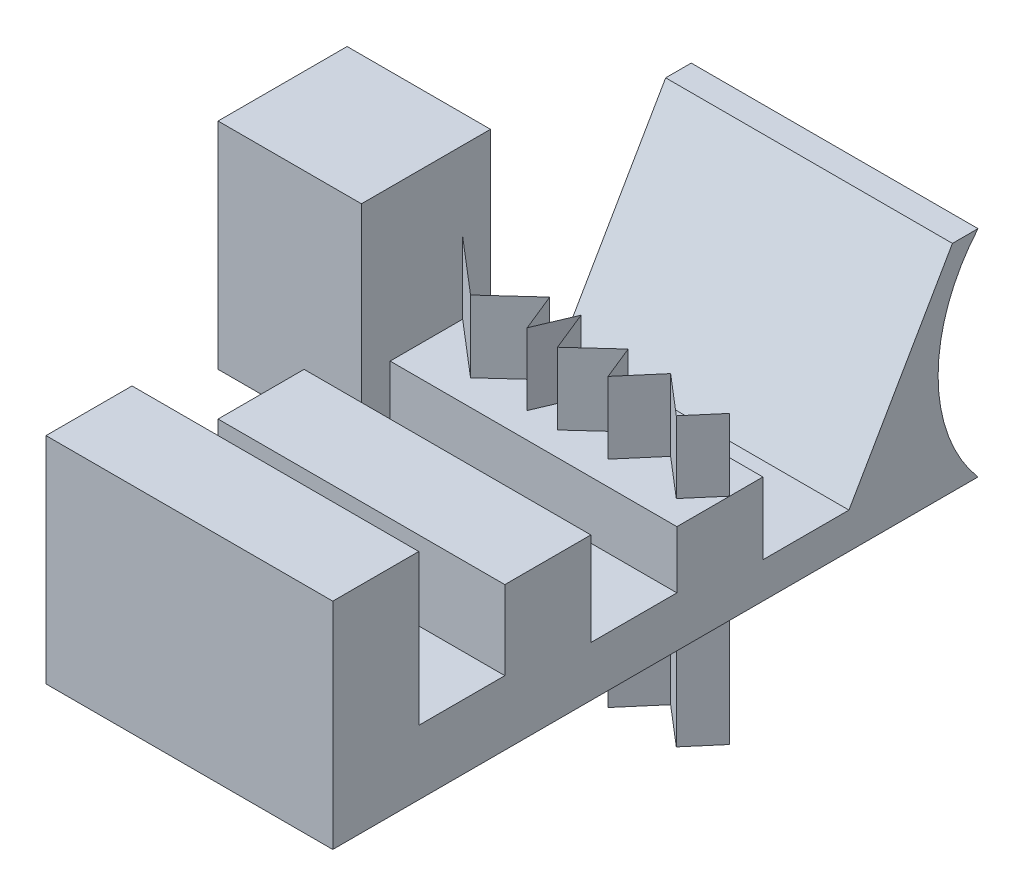
ISO-10303-21;
HEADER;
FILE_DESCRIPTION(('STEP AP214'),'2;1');
FILE_NAME('part.step','',(''),(''),'','','');
FILE_SCHEMA(('AUTOMOTIVE_DESIGN { 1 0 10303 214 1 1 1 1 }'));
ENDSEC;
DATA;
#1=APPLICATION_CONTEXT('core data for automotive mechanical design processes');
#2=APPLICATION_PROTOCOL_DEFINITION('international standard','automotive_design',2000,#1);
#3=PRODUCT_CONTEXT('',#1,'mechanical');
#4=PRODUCT('Part','Part','',(#3));
#5=PRODUCT_RELATED_PRODUCT_CATEGORY('part','',(#4));
#6=PRODUCT_DEFINITION_FORMATION('','',#4);
#7=PRODUCT_DEFINITION_CONTEXT('part definition',#1,'design');
#8=PRODUCT_DEFINITION('design','',#6,#7);
#9=PRODUCT_DEFINITION_SHAPE('','',#8);
#10=(LENGTH_UNIT() NAMED_UNIT(*) SI_UNIT(.MILLI.,.METRE.));
#11=(NAMED_UNIT(*) PLANE_ANGLE_UNIT() SI_UNIT($,.RADIAN.));
#12=(NAMED_UNIT(*) SI_UNIT($,.STERADIAN.) SOLID_ANGLE_UNIT());
#13=UNCERTAINTY_MEASURE_WITH_UNIT(LENGTH_MEASURE(1.E-05),#10,'distance_accuracy_value','');
#14=(GEOMETRIC_REPRESENTATION_CONTEXT(3) GLOBAL_UNCERTAINTY_ASSIGNED_CONTEXT((#13)) GLOBAL_UNIT_ASSIGNED_CONTEXT((#10,
#11,#12)) REPRESENTATION_CONTEXT('',''));
#15=CARTESIAN_POINT('',(0.,0.,0.));
#16=DIRECTION('',(0.,0.,1.));
#17=DIRECTION('',(1.,0.,0.));
#18=AXIS2_PLACEMENT_3D('',#15,#16,#17);
#19=CARTESIAN_POINT('',(-100.,75.,-290.585453274587));
#20=DIRECTION('',(-0.650171661517979,0.,0.759787345616489));
#21=DIRECTION('',(0.759787345616489,0.,0.650171661517979));
#22=AXIS2_PLACEMENT_3D('',#19,#20,#21);
#23=PLANE('',#22);
#24=DIRECTION('',(0.759787345616489,0.,0.650171661517979));
#25=VECTOR('',#24,1.);
#26=CARTESIAN_POINT('',(-100.,125.,-290.585453274587));
#27=LINE('',#26,#25);
#28=CARTESIAN_POINT('',(-100.,125.,-290.585453274587));
#29=VERTEX_POINT('',#28);
#30=CARTESIAN_POINT('',(-61.8619400347087,125.,-257.949629635558));
#31=VERTEX_POINT('',#30);
#32=EDGE_CURVE('E56',#29,#31,#27,.T.);
#33=ORIENTED_EDGE('',*,*,#32,.F.);
#34=DIRECTION('',(0.,1.,0.));
#35=VECTOR('',#34,1.);
#36=CARTESIAN_POINT('',(-100.,75.,-290.585453274587));
#37=LINE('',#36,#35);
#38=CARTESIAN_POINT('',(-100.,-75.,-290.585453274587));
#39=VERTEX_POINT('',#38);
#40=EDGE_CURVE('E12',#39,#29,#37,.T.);
#41=ORIENTED_EDGE('',*,*,#40,.F.);
#42=DIRECTION('',(0.759787345616489,0.,0.650171661517979));
#43=VECTOR('',#42,1.);
#44=CARTESIAN_POINT('',(-100.,-75.,-290.585453274587));
#45=LINE('',#44,#43);
#46=CARTESIAN_POINT('',(-61.8619400347087,-75.,-257.949629635558));
#47=VERTEX_POINT('',#46);
#48=EDGE_CURVE('E131',#39,#47,#45,.T.);
#49=ORIENTED_EDGE('',*,*,#48,.T.);
#50=DIRECTION('',(0.,1.,0.));
#51=VECTOR('',#50,1.);
#52=CARTESIAN_POINT('',(-61.8619400347087,75.,-257.949629635558));
#53=LINE('',#52,#51);
#54=EDGE_CURVE('E171',#47,#31,#53,.T.);
#55=ORIENTED_EDGE('',*,*,#54,.T.);
#56=EDGE_LOOP('',(#33,#41,#49,#55));
#57=FACE_BOUND('',#56,.T.);
#58=ADVANCED_FACE('F50',(#57),#23,.T.);
#59=CARTESIAN_POINT('',(-61.8619400347087,75.,-257.949629635558));
#60=DIRECTION('',(0.674269364021333,0.,0.738485493928126));
#61=DIRECTION('',(0.738485493928126,0.,-0.674269364021333));
#62=AXIS2_PLACEMENT_3D('',#59,#60,#61);
#63=PLANE('',#62);
#64=DIRECTION('',(0.738485493928126,0.,-0.674269364021333));
#65=VECTOR('',#64,1.);
#66=CARTESIAN_POINT('',(-61.8619400347087,125.,-257.949629635558));
#67=LINE('',#66,#65);
#68=CARTESIAN_POINT('',(-32.9917883540292,125.,-284.309333344005));
#69=VERTEX_POINT('',#68);
#70=EDGE_CURVE('E172',#31,#69,#67,.T.);
#71=ORIENTED_EDGE('',*,*,#70,.F.);
#72=ORIENTED_EDGE('',*,*,#54,.F.);
#73=DIRECTION('',(0.738485493928126,0.,-0.674269364021333));
#74=VECTOR('',#73,1.);
#75=CARTESIAN_POINT('',(-61.8619400347087,-75.,-257.949629635558));
#76=LINE('',#75,#74);
#77=CARTESIAN_POINT('',(-32.9917883540292,-75.,-284.309333344005));
#78=VERTEX_POINT('',#77);
#79=EDGE_CURVE('E135',#47,#78,#76,.T.);
#80=ORIENTED_EDGE('',*,*,#79,.T.);
#81=DIRECTION('',(0.,1.,0.));
#82=VECTOR('',#81,1.);
#83=CARTESIAN_POINT('',(-32.9917883540292,75.,-284.309333344005));
#84=LINE('',#83,#82);
#85=EDGE_CURVE('E176',#78,#69,#84,.T.);
#86=ORIENTED_EDGE('',*,*,#85,.T.);
#87=EDGE_LOOP('',(#71,#72,#80,#86));
#88=FACE_BOUND('',#87,.T.);
#89=ADVANCED_FACE('F228',(#88),#63,.T.);
#90=CARTESIAN_POINT('',(-32.9917883540292,75.,-284.309333344005));
#91=DIRECTION('',(-0.926946813223158,0.,0.375192757733185));
#92=DIRECTION('',(0.375192757733185,0.,0.926946813223158));
#93=AXIS2_PLACEMENT_3D('',#90,#91,#92);
#94=PLANE('',#93);
#95=DIRECTION('',(0.375192757733185,0.,0.926946813223158));
#96=VECTOR('',#95,1.);
#97=CARTESIAN_POINT('',(-32.9917883540292,125.,-284.309333344005));
#98=LINE('',#97,#96);
#99=CARTESIAN_POINT('',(-22.3223844720388,125.,-257.949629635558));
#100=VERTEX_POINT('',#99);
#101=EDGE_CURVE('E177',#69,#100,#98,.T.);
#102=ORIENTED_EDGE('',*,*,#101,.F.);
#103=ORIENTED_EDGE('',*,*,#85,.F.);
#104=DIRECTION('',(0.375192757733185,0.,0.926946813223158));
#105=VECTOR('',#104,1.);
#106=CARTESIAN_POINT('',(-32.9917883540292,-75.,-284.309333344005));
#107=LINE('',#106,#105);
#108=CARTESIAN_POINT('',(-22.3223844720388,-75.,-257.949629635558));
#109=VERTEX_POINT('',#108);
#110=EDGE_CURVE('E143',#78,#109,#107,.T.);
#111=ORIENTED_EDGE('',*,*,#110,.T.);
#112=DIRECTION('',(0.,1.,0.));
#113=VECTOR('',#112,1.);
#114=CARTESIAN_POINT('',(-22.3223844720388,75.,-257.949629635558));
#115=LINE('',#114,#113);
#116=EDGE_CURVE('E181',#109,#100,#115,.T.);
#117=ORIENTED_EDGE('',*,*,#116,.T.);
#118=EDGE_LOOP('',(#102,#103,#111,#117));
#119=FACE_BOUND('',#118,.T.);
#120=ADVANCED_FACE('F232',(#119),#94,.T.);
#121=CARTESIAN_POINT('',(-22.3223844720388,75.,-257.949629635558));
#122=DIRECTION('',(0.920751720674579,0.,0.39014903418412));
#123=DIRECTION('',(0.39014903418412,0.,-0.920751720674579));
#124=AXIS2_PLACEMENT_3D('',#121,#122,#123);
#125=PLANE('',#124);
#126=DIRECTION('',(0.39014903418412,0.,-0.920751720674579));
#127=VECTOR('',#126,1.);
#128=CARTESIAN_POINT('',(-22.3223844720388,125.,-257.949629635558));
#129=LINE('',#128,#127);
#130=CARTESIAN_POINT('',(-11.1530184938842,125.,-284.309333344005));
#131=VERTEX_POINT('',#130);
#132=EDGE_CURVE('E182',#100,#131,#129,.T.);
#133=ORIENTED_EDGE('',*,*,#132,.F.);
#134=ORIENTED_EDGE('',*,*,#116,.F.);
#135=DIRECTION('',(0.39014903418412,0.,-0.920751720674579));
#136=VECTOR('',#135,1.);
#137=CARTESIAN_POINT('',(-22.3223844720388,-75.,-257.949629635558));
#138=LINE('',#137,#136);
#139=CARTESIAN_POINT('',(-11.1530184938842,-75.,-284.309333344005));
#140=VERTEX_POINT('',#139);
#141=EDGE_CURVE('E148',#109,#140,#138,.T.);
#142=ORIENTED_EDGE('',*,*,#141,.T.);
#143=DIRECTION('',(0.,1.,0.));
#144=VECTOR('',#143,1.);
#145=CARTESIAN_POINT('',(-11.1530184938842,75.,-284.309333344005));
#146=LINE('',#145,#144);
#147=EDGE_CURVE('E186',#140,#131,#146,.T.);
#148=ORIENTED_EDGE('',*,*,#147,.T.);
#149=EDGE_LOOP('',(#133,#134,#142,#148));
#150=FACE_BOUND('',#149,.T.);
#151=ADVANCED_FACE('F236',(#150),#125,.T.);
#152=CARTESIAN_POINT('',(-11.1530184938842,75.,-284.309333344005));
#153=DIRECTION('',(-0.926946813223157,0.,0.375192757733186));
#154=DIRECTION('',(0.375192757733186,0.,0.926946813223157));
#155=AXIS2_PLACEMENT_3D('',#152,#153,#154);
#156=PLANE('',#155);
#157=DIRECTION('',(0.375192757733186,0.,0.926946813223157));
#158=VECTOR('',#157,1.);
#159=CARTESIAN_POINT('',(-11.1530184938842,125.,-284.309333344005));
#160=LINE('',#159,#158);
#161=CARTESIAN_POINT('',(0.,125.,-256.754817064997));
#162=VERTEX_POINT('',#161);
#163=EDGE_CURVE('E187',#131,#162,#160,.T.);
#164=ORIENTED_EDGE('',*,*,#163,.F.);
#165=ORIENTED_EDGE('',*,*,#147,.F.);
#166=DIRECTION('',(0.375192757733186,0.,0.926946813223157));
#167=VECTOR('',#166,1.);
#168=CARTESIAN_POINT('',(-11.1530184938842,-75.,-284.309333344005));
#169=LINE('',#168,#167);
#170=CARTESIAN_POINT('',(0.,-75.,-256.754817064997));
#171=VERTEX_POINT('',#170);
#172=EDGE_CURVE('E151',#140,#171,#169,.T.);
#173=ORIENTED_EDGE('',*,*,#172,.T.);
#174=DIRECTION('',(0.,1.,0.));
#175=VECTOR('',#174,1.);
#176=CARTESIAN_POINT('',(0.,75.,-256.754817064997));
#177=LINE('',#176,#175);
#178=EDGE_CURVE('E191',#171,#162,#177,.T.);
#179=ORIENTED_EDGE('',*,*,#178,.T.);
#180=EDGE_LOOP('',(#164,#165,#173,#179));
#181=FACE_BOUND('',#180,.T.);
#182=ADVANCED_FACE('F240',(#181),#156,.T.);
#183=CARTESIAN_POINT('',(0.,75.,-256.754817064997));
#184=DIRECTION('',(0.674269364021333,0.,0.738485493928126));
#185=DIRECTION('',(0.738485493928126,0.,-0.674269364021333));
#186=AXIS2_PLACEMENT_3D('',#183,#184,#185);
#187=PLANE('',#186);
#188=DIRECTION('',(0.738485493928126,0.,-0.674269364021333));
#189=VECTOR('',#188,1.);
#190=CARTESIAN_POINT('',(0.,125.,-256.754817064997));
#191=LINE('',#190,#189);
#192=CARTESIAN_POINT('',(25.7440446324172,125.,-280.260249120682));
#193=VERTEX_POINT('',#192);
#194=EDGE_CURVE('E192',#162,#193,#191,.T.);
#195=ORIENTED_EDGE('',*,*,#194,.F.);
#196=ORIENTED_EDGE('',*,*,#178,.F.);
#197=DIRECTION('',(0.738485493928126,0.,-0.674269364021333));
#198=VECTOR('',#197,1.);
#199=CARTESIAN_POINT('',(0.,-75.,-256.754817064997));
#200=LINE('',#199,#198);
#201=CARTESIAN_POINT('',(25.7440446324172,-75.,-280.260249120682));
#202=VERTEX_POINT('',#201);
#203=EDGE_CURVE('E154',#171,#202,#200,.T.);
#204=ORIENTED_EDGE('',*,*,#203,.T.);
#205=DIRECTION('',(0.,1.,0.));
#206=VECTOR('',#205,1.);
#207=CARTESIAN_POINT('',(25.7440446324172,75.,-280.260249120682));
#208=LINE('',#207,#206);
#209=EDGE_CURVE('E196',#202,#193,#208,.T.);
#210=ORIENTED_EDGE('',*,*,#209,.T.);
#211=EDGE_LOOP('',(#195,#196,#204,#210));
#212=FACE_BOUND('',#211,.T.);
#213=ADVANCED_FACE('F244',(#212),#187,.T.);
#214=CARTESIAN_POINT('',(25.7440446324172,75.,-280.260249120682));
#215=DIRECTION('',(-0.926946813223158,0.,0.375192757733185));
#216=DIRECTION('',(0.375192757733185,0.,0.926946813223158));
#217=AXIS2_PLACEMENT_3D('',#214,#215,#216);
#218=PLANE('',#217);
#219=DIRECTION('',(0.375192757733185,0.,0.926946813223158));
#220=VECTOR('',#219,1.);
#221=CARTESIAN_POINT('',(25.7440446324172,125.,-280.260249120682));
#222=LINE('',#221,#220);
#223=CARTESIAN_POINT('',(35.258148083528,125.,-256.754817064997));
#224=VERTEX_POINT('',#223);
#225=EDGE_CURVE('E197',#193,#224,#222,.T.);
#226=ORIENTED_EDGE('',*,*,#225,.F.);
#227=ORIENTED_EDGE('',*,*,#209,.F.);
#228=DIRECTION('',(0.375192757733185,0.,0.926946813223158));
#229=VECTOR('',#228,1.);
#230=CARTESIAN_POINT('',(25.7440446324172,-75.,-280.260249120682));
#231=LINE('',#230,#229);
#232=CARTESIAN_POINT('',(35.258148083528,-75.,-256.754817064997));
#233=VERTEX_POINT('',#232);
#234=EDGE_CURVE('E157',#202,#233,#231,.T.);
#235=ORIENTED_EDGE('',*,*,#234,.T.);
#236=DIRECTION('',(0.,1.,0.));
#237=VECTOR('',#236,1.);
#238=CARTESIAN_POINT('',(35.258148083528,75.,-256.754817064997));
#239=LINE('',#238,#237);
#240=EDGE_CURVE('E201',#233,#224,#239,.T.);
#241=ORIENTED_EDGE('',*,*,#240,.T.);
#242=EDGE_LOOP('',(#226,#227,#235,#241));
#243=FACE_BOUND('',#242,.T.);
#244=ADVANCED_FACE('F248',(#243),#218,.T.);
#245=CARTESIAN_POINT('',(35.258148083528,75.,-256.754817064997));
#246=DIRECTION('',(0.75978734561649,0.,0.650171661517979));
#247=DIRECTION('',(0.650171661517979,0.,-0.75978734561649));
#248=AXIS2_PLACEMENT_3D('',#245,#246,#247);
#249=PLANE('',#248);
#250=DIRECTION('',(0.650171661517978,0.,-0.75978734561649));
#251=VECTOR('',#250,1.);
#252=CARTESIAN_POINT('',(35.258148083528,125.,-256.754817064997));
#253=LINE('',#252,#251);
#254=CARTESIAN_POINT('',(55.3724154538836,125.,-280.260249120682));
#255=VERTEX_POINT('',#254);
#256=EDGE_CURVE('E202',#224,#255,#253,.T.);
#257=ORIENTED_EDGE('',*,*,#256,.F.);
#258=ORIENTED_EDGE('',*,*,#240,.F.);
#259=DIRECTION('',(0.650171661517978,0.,-0.75978734561649));
#260=VECTOR('',#259,1.);
#261=CARTESIAN_POINT('',(35.258148083528,-75.,-256.754817064997));
#262=LINE('',#261,#260);
#263=CARTESIAN_POINT('',(55.3724154538836,-75.,-280.260249120682));
#264=VERTEX_POINT('',#263);
#265=EDGE_CURVE('E160',#233,#264,#262,.T.);
#266=ORIENTED_EDGE('',*,*,#265,.T.);
#267=DIRECTION('',(0.,1.,0.));
#268=VECTOR('',#267,1.);
#269=CARTESIAN_POINT('',(55.3724154538836,75.,-280.260249120682));
#270=LINE('',#269,#268);
#271=EDGE_CURVE('E206',#264,#255,#270,.T.);
#272=ORIENTED_EDGE('',*,*,#271,.T.);
#273=EDGE_LOOP('',(#257,#258,#266,#272));
#274=FACE_BOUND('',#273,.T.);
#275=ADVANCED_FACE('F252',(#274),#249,.T.);
#276=CARTESIAN_POINT('',(55.3724154538836,75.,-280.260249120682));
#277=DIRECTION('',(-0.650171661517979,0.,0.75978734561649));
#278=DIRECTION('',(0.75978734561649,0.,0.650171661517979));
#279=AXIS2_PLACEMENT_3D('',#276,#277,#278);
#280=PLANE('',#279);
#281=DIRECTION('',(0.75978734561649,0.,0.650171661517979));
#282=VECTOR('',#281,1.);
#283=CARTESIAN_POINT('',(55.3724154538836,125.,-280.260249120682));
#284=LINE('',#283,#282);
#285=CARTESIAN_POINT('',(82.8407455675977,125.,-256.754817064997));
#286=VERTEX_POINT('',#285);
#287=EDGE_CURVE('E207',#255,#286,#284,.T.);
#288=ORIENTED_EDGE('',*,*,#287,.F.);
#289=ORIENTED_EDGE('',*,*,#271,.F.);
#290=DIRECTION('',(0.75978734561649,0.,0.650171661517979));
#291=VECTOR('',#290,1.);
#292=CARTESIAN_POINT('',(55.3724154538836,-75.,-280.260249120682));
#293=LINE('',#292,#291);
#294=CARTESIAN_POINT('',(82.8407455675977,-75.,-256.754817064997));
#295=VERTEX_POINT('',#294);
#296=EDGE_CURVE('E163',#264,#295,#293,.T.);
#297=ORIENTED_EDGE('',*,*,#296,.T.);
#298=DIRECTION('',(0.,1.,0.));
#299=VECTOR('',#298,1.);
#300=CARTESIAN_POINT('',(82.8407455675977,75.,-256.754817064997));
#301=LINE('',#300,#299);
#302=EDGE_CURVE('E141',#295,#286,#301,.T.);
#303=ORIENTED_EDGE('',*,*,#302,.T.);
#304=EDGE_LOOP('',(#288,#289,#297,#303));
#305=FACE_BOUND('',#304,.T.);
#306=ADVANCED_FACE('F256',(#305),#280,.T.);
#307=CARTESIAN_POINT('',(82.8407455675977,75.,-256.754817064997));
#308=DIRECTION('',(0.75978734561649,0.,0.650171661517978));
#309=DIRECTION('',(0.650171661517978,0.,-0.75978734561649));
#310=AXIS2_PLACEMENT_3D('',#307,#308,#309);
#311=PLANE('',#310);
#312=DIRECTION('',(0.650171661517978,0.,-0.75978734561649));
#313=VECTOR('',#312,1.);
#314=CARTESIAN_POINT('',(82.8407455675977,125.,-256.754817064997));
#315=LINE('',#314,#313);
#316=CARTESIAN_POINT('',(100.,125.,-276.807035809065));
#317=VERTEX_POINT('',#316);
#318=EDGE_CURVE('E67',#286,#317,#315,.T.);
#319=ORIENTED_EDGE('',*,*,#318,.F.);
#320=ORIENTED_EDGE('',*,*,#302,.F.);
#321=DIRECTION('',(0.650171661517978,0.,-0.75978734561649));
#322=VECTOR('',#321,1.);
#323=CARTESIAN_POINT('',(82.8407455675977,-75.,-256.754817064997));
#324=LINE('',#323,#322);
#325=CARTESIAN_POINT('',(100.,-75.,-276.807035809065));
#326=VERTEX_POINT('',#325);
#327=EDGE_CURVE('E166',#295,#326,#324,.T.);
#328=ORIENTED_EDGE('',*,*,#327,.T.);
#329=DIRECTION('',(0.,1.,0.));
#330=VECTOR('',#329,1.);
#331=CARTESIAN_POINT('',(100.,75.,-276.807035809065));
#332=LINE('',#331,#330);
#333=EDGE_CURVE('E63',#326,#317,#332,.T.);
#334=ORIENTED_EDGE('',*,*,#333,.T.);
#335=EDGE_LOOP('',(#319,#320,#328,#334));
#336=FACE_BOUND('',#335,.T.);
#337=ADVANCED_FACE('F258',(#336),#311,.T.);
#338=OPEN_SHELL('',(#58,#89,#120,#151,#182,#213,#244,#275,#306,#337));
#339=SHELL_BASED_SURFACE_MODEL('B2',(#338));
#340=CARTESIAN_POINT('',(-230.,150.,-250.));
#341=DIRECTION('',(-1.,0.,0.));
#342=DIRECTION('',(0.,0.,1.));
#343=AXIS2_PLACEMENT_3D('',#340,#341,#342);
#344=PLANE('',#343);
#345=DIRECTION('',(0.,0.,-1.));
#346=VECTOR('',#345,1.);
#347=CARTESIAN_POINT('',(-230.,0.,-250.));
#348=LINE('',#347,#346);
#349=CARTESIAN_POINT('',(-230.,0.,-250.));
#350=VERTEX_POINT('',#349);
#351=CARTESIAN_POINT('',(-230.,0.,-340.));
#352=VERTEX_POINT('',#351);
#353=EDGE_CURVE('E455',#350,#352,#348,.T.);
#354=ORIENTED_EDGE('',*,*,#353,.F.);
#355=DIRECTION('',(0.,-1.,0.));
#356=VECTOR('',#355,1.);
#357=CARTESIAN_POINT('',(-230.,150.,-250.));
#358=LINE('',#357,#356);
#359=CARTESIAN_POINT('',(-230.,150.,-250.));
#360=VERTEX_POINT('',#359);
#361=EDGE_CURVE('E48',#360,#350,#358,.T.);
#362=ORIENTED_EDGE('',*,*,#361,.F.);
#363=DIRECTION('',(0.,0.,-1.));
#364=VECTOR('',#363,1.);
#365=CARTESIAN_POINT('',(-230.,150.,-250.));
#366=LINE('',#365,#364);
#367=CARTESIAN_POINT('',(-230.,150.,-340.));
#368=VERTEX_POINT('',#367);
#369=EDGE_CURVE('E449',#360,#368,#366,.T.);
#370=ORIENTED_EDGE('',*,*,#369,.T.);
#371=DIRECTION('',(0.,-1.,0.));
#372=VECTOR('',#371,1.);
#373=CARTESIAN_POINT('',(-230.,150.,-340.));
#374=LINE('',#373,#372);
#375=EDGE_CURVE('E394',#368,#352,#374,.T.);
#376=ORIENTED_EDGE('',*,*,#375,.T.);
#377=EDGE_LOOP('',(#354,#362,#370,#376));
#378=FACE_BOUND('',#377,.T.);
#379=ADVANCED_FACE('F391',(#378),#344,.T.);
#380=CARTESIAN_POINT('',(-230.,150.,-250.));
#381=DIRECTION('',(0.,0.,1.));
#382=DIRECTION('',(0.,-1.,0.));
#383=AXIS2_PLACEMENT_3D('',#380,#381,#382);
#384=PLANE('',#383);
#385=DIRECTION('',(-1.,0.,0.));
#386=VECTOR('',#385,1.);
#387=CARTESIAN_POINT('',(-230.,0.,-250.));
#388=LINE('',#387,#386);
#389=CARTESIAN_POINT('',(-130.,0.,-250.));
#390=VERTEX_POINT('',#389);
#391=EDGE_CURVE('E451',#390,#350,#388,.T.);
#392=ORIENTED_EDGE('',*,*,#391,.F.);
#393=DIRECTION('',(0.,-1.,0.));
#394=VECTOR('',#393,1.);
#395=CARTESIAN_POINT('',(-130.,150.,-250.));
#396=LINE('',#395,#394);
#397=CARTESIAN_POINT('',(-130.,150.,-250.));
#398=VERTEX_POINT('',#397);
#399=EDGE_CURVE('E400',#398,#390,#396,.T.);
#400=ORIENTED_EDGE('',*,*,#399,.F.);
#401=DIRECTION('',(-1.,0.,0.));
#402=VECTOR('',#401,1.);
#403=CARTESIAN_POINT('',(-230.,150.,-250.));
#404=LINE('',#403,#402);
#405=EDGE_CURVE('E446',#398,#360,#404,.T.);
#406=ORIENTED_EDGE('',*,*,#405,.T.);
#407=ORIENTED_EDGE('',*,*,#361,.T.);
#408=EDGE_LOOP('',(#392,#400,#406,#407));
#409=FACE_BOUND('',#408,.T.);
#410=ADVANCED_FACE('F465',(#409),#384,.T.);
#411=CARTESIAN_POINT('',(-130.,150.,-250.));
#412=DIRECTION('',(1.,0.,0.));
#413=DIRECTION('',(0.,0.,-1.));
#414=AXIS2_PLACEMENT_3D('',#411,#412,#413);
#415=PLANE('',#414);
#416=DIRECTION('',(0.,0.,1.));
#417=VECTOR('',#416,1.);
#418=CARTESIAN_POINT('',(-130.,0.,-250.));
#419=LINE('',#418,#417);
#420=CARTESIAN_POINT('',(-130.,0.,-340.));
#421=VERTEX_POINT('',#420);
#422=EDGE_CURVE('E441',#421,#390,#419,.T.);
#423=ORIENTED_EDGE('',*,*,#422,.F.);
#424=DIRECTION('',(0.,-1.,0.));
#425=VECTOR('',#424,1.);
#426=CARTESIAN_POINT('',(-130.,150.,-340.));
#427=LINE('',#426,#425);
#428=CARTESIAN_POINT('',(-130.,150.,-340.));
#429=VERTEX_POINT('',#428);
#430=EDGE_CURVE('E436',#429,#421,#427,.T.);
#431=ORIENTED_EDGE('',*,*,#430,.F.);
#432=DIRECTION('',(0.,0.,1.));
#433=VECTOR('',#432,1.);
#434=CARTESIAN_POINT('',(-130.,150.,-250.));
#435=LINE('',#434,#433);
#436=EDGE_CURVE('E439',#429,#398,#435,.T.);
#437=ORIENTED_EDGE('',*,*,#436,.T.);
#438=ORIENTED_EDGE('',*,*,#399,.T.);
#439=EDGE_LOOP('',(#423,#431,#437,#438));
#440=FACE_BOUND('',#439,.T.);
#441=ADVANCED_FACE('F438',(#440),#415,.T.);
#442=CARTESIAN_POINT('',(-230.,150.,-340.));
#443=DIRECTION('',(0.,0.,-1.));
#444=DIRECTION('',(0.,1.,0.));
#445=AXIS2_PLACEMENT_3D('',#442,#443,#444);
#446=PLANE('',#445);
#447=DIRECTION('',(1.,0.,0.));
#448=VECTOR('',#447,1.);
#449=CARTESIAN_POINT('',(-230.,0.,-340.));
#450=LINE('',#449,#448);
#451=EDGE_CURVE('E458',#352,#421,#450,.T.);
#452=ORIENTED_EDGE('',*,*,#451,.F.);
#453=ORIENTED_EDGE('',*,*,#375,.F.);
#454=DIRECTION('',(1.,0.,0.));
#455=VECTOR('',#454,1.);
#456=CARTESIAN_POINT('',(-230.,150.,-340.));
#457=LINE('',#456,#455);
#458=EDGE_CURVE('E445',#368,#429,#457,.T.);
#459=ORIENTED_EDGE('',*,*,#458,.T.);
#460=ORIENTED_EDGE('',*,*,#430,.T.);
#461=EDGE_LOOP('',(#452,#453,#459,#460));
#462=FACE_BOUND('',#461,.T.);
#463=ADVANCED_FACE('F448',(#462),#446,.T.);
#464=CARTESIAN_POINT('',(0.,150.,0.));
#465=DIRECTION('',(0.,-1.,0.));
#466=DIRECTION('',(0.,0.,-1.));
#467=AXIS2_PLACEMENT_3D('',#464,#465,#466);
#468=PLANE('',#467);
#469=ORIENTED_EDGE('',*,*,#369,.F.);
#470=ORIENTED_EDGE('',*,*,#405,.F.);
#471=ORIENTED_EDGE('',*,*,#436,.F.);
#472=ORIENTED_EDGE('',*,*,#458,.F.);
#473=EDGE_LOOP('',(#469,#470,#471,#472));
#474=FACE_BOUND('',#473,.T.);
#475=ADVANCED_FACE('F444',(#474),#468,.F.);
#476=CARTESIAN_POINT('',(0.,0.,0.));
#477=DIRECTION('',(0.,-1.,0.));
#478=DIRECTION('',(0.,0.,-1.));
#479=AXIS2_PLACEMENT_3D('',#476,#477,#478);
#480=PLANE('',#479);
#481=ORIENTED_EDGE('',*,*,#353,.T.);
#482=ORIENTED_EDGE('',*,*,#451,.T.);
#483=ORIENTED_EDGE('',*,*,#422,.T.);
#484=ORIENTED_EDGE('',*,*,#391,.T.);
#485=EDGE_LOOP('',(#481,#482,#483,#484));
#486=FACE_BOUND('',#485,.T.);
#487=ADVANCED_FACE('F464',(#486),#480,.T.);
#488=CLOSED_SHELL('',(#379,#410,#441,#463,#475,#487));
#489=MANIFOLD_SOLID_BREP('B6',#488);
#490=CARTESIAN_POINT('',(100.,0.,-450.));
#491=DIRECTION('',(0.,1.,0.));
#492=DIRECTION('',(0.,0.,1.));
#493=AXIS2_PLACEMENT_3D('',#490,#491,#492);
#494=PLANE('',#493);
#495=DIRECTION('',(0.,0.,-1.));
#496=VECTOR('',#495,1.);
#497=CARTESIAN_POINT('',(-100.,0.,-450.));
#498=LINE('',#497,#496);
#499=CARTESIAN_POINT('',(-100.,0.,0.));
#500=VERTEX_POINT('',#499);
#501=CARTESIAN_POINT('',(-100.,0.,-450.));
#502=VERTEX_POINT('',#501);
#503=EDGE_CURVE('E658',#500,#502,#498,.T.);
#504=ORIENTED_EDGE('',*,*,#503,.T.);
#505=DIRECTION('',(-1.,0.,0.));
#506=VECTOR('',#505,1.);
#507=CARTESIAN_POINT('',(100.,0.,-450.));
#508=LINE('',#507,#506);
#509=CARTESIAN_POINT('',(100.,0.,-450.));
#510=VERTEX_POINT('',#509);
#511=EDGE_CURVE('E389',#510,#502,#508,.T.);
#512=ORIENTED_EDGE('',*,*,#511,.F.);
#513=DIRECTION('',(0.,0.,-1.));
#514=VECTOR('',#513,1.);
#515=CARTESIAN_POINT('',(100.,0.,-450.));
#516=LINE('',#515,#514);
#517=CARTESIAN_POINT('',(100.,0.,0.));
#518=VERTEX_POINT('',#517);
#519=EDGE_CURVE('E688',#518,#510,#516,.T.);
#520=ORIENTED_EDGE('',*,*,#519,.F.);
#521=DIRECTION('',(-1.,0.,0.));
#522=VECTOR('',#521,1.);
#523=CARTESIAN_POINT('',(100.,0.,0.));
#524=LINE('',#523,#522);
#525=EDGE_CURVE('E654',#518,#500,#524,.T.);
#526=ORIENTED_EDGE('',*,*,#525,.T.);
#527=EDGE_LOOP('',(#504,#512,#520,#526));
#528=FACE_BOUND('',#527,.T.);
#529=ADVANCED_FACE('F514',(#528),#494,.F.);
#530=CARTESIAN_POINT('',(100.,75.,-537.177978870813));
#531=DIRECTION('',(-1.,0.,0.));
#532=DIRECTION('',(0.,0.,1.));
#533=AXIS2_PLACEMENT_3D('',#530,#531,#532);
#534=CYLINDRICAL_SURFACE('',#533,115.);
#535=CARTESIAN_POINT('',(-100.,75.,-537.177978870813));
#536=DIRECTION('',(-1.,0.,0.));
#537=DIRECTION('',(0.,0.,-1.));
#538=AXIS2_PLACEMENT_3D('',#535,#536,#537);
#539=CIRCLE('',#538,115.);
#540=CARTESIAN_POINT('',(-100.,150.,-450.));
#541=VERTEX_POINT('',#540);
#542=EDGE_CURVE('E661',#502,#541,#539,.T.);
#543=ORIENTED_EDGE('',*,*,#542,.T.);
#544=DIRECTION('',(-1.,0.,0.));
#545=VECTOR('',#544,1.);
#546=CARTESIAN_POINT('',(100.,150.,-450.));
#547=LINE('',#546,#545);
#548=CARTESIAN_POINT('',(100.,150.,-450.));
#549=VERTEX_POINT('',#548);
#550=EDGE_CURVE('E522',#549,#541,#547,.T.);
#551=ORIENTED_EDGE('',*,*,#550,.F.);
#552=CARTESIAN_POINT('',(100.,75.,-537.177978870813));
#553=DIRECTION('',(-1.,0.,0.));
#554=DIRECTION('',(0.,0.,-1.));
#555=AXIS2_PLACEMENT_3D('',#552,#553,#554);
#556=CIRCLE('',#555,115.);
#557=EDGE_CURVE('E597',#510,#549,#556,.T.);
#558=ORIENTED_EDGE('',*,*,#557,.F.);
#559=ORIENTED_EDGE('',*,*,#511,.T.);
#560=EDGE_LOOP('',(#543,#551,#558,#559));
#561=FACE_BOUND('',#560,.T.);
#562=ADVANCED_FACE('F786',(#561),#534,.F.);
#563=CARTESIAN_POINT('',(100.,150.,-432.168783648703));
#564=DIRECTION('',(0.,-1.,0.));
#565=DIRECTION('',(0.,0.,-1.));
#566=AXIS2_PLACEMENT_3D('',#563,#564,#565);
#567=PLANE('',#566);
#568=DIRECTION('',(0.,0.,1.));
#569=VECTOR('',#568,1.);
#570=CARTESIAN_POINT('',(-100.,150.,-432.168783648703));
#571=LINE('',#570,#569);
#572=CARTESIAN_POINT('',(-100.,150.,-432.168783648703));
#573=VERTEX_POINT('',#572);
#574=EDGE_CURVE('E663',#541,#573,#571,.T.);
#575=ORIENTED_EDGE('',*,*,#574,.T.);
#576=DIRECTION('',(-1.,0.,0.));
#577=VECTOR('',#576,1.);
#578=CARTESIAN_POINT('',(100.,150.,-432.168783648703));
#579=LINE('',#578,#577);
#580=CARTESIAN_POINT('',(100.,150.,-432.168783648703));
#581=VERTEX_POINT('',#580);
#582=EDGE_CURVE('E719',#581,#573,#579,.T.);
#583=ORIENTED_EDGE('',*,*,#582,.F.);
#584=DIRECTION('',(0.,0.,1.));
#585=VECTOR('',#584,1.);
#586=CARTESIAN_POINT('',(100.,150.,-432.168783648703));
#587=LINE('',#586,#585);
#588=EDGE_CURVE('E727',#549,#581,#587,.T.);
#589=ORIENTED_EDGE('',*,*,#588,.F.);
#590=ORIENTED_EDGE('',*,*,#550,.T.);
#591=EDGE_LOOP('',(#575,#583,#589,#590));
#592=FACE_BOUND('',#591,.T.);
#593=ADVANCED_FACE('F725',(#592),#567,.F.);
#594=CARTESIAN_POINT('',(100.,25.,-360.));
#595=DIRECTION('',(0.,-0.499999999999997,-0.86602540378444));
#596=DIRECTION('',(0.,0.86602540378444,-0.499999999999997));
#597=AXIS2_PLACEMENT_3D('',#594,#595,#596);
#598=PLANE('',#597);
#599=DIRECTION('',(0.,-0.86602540378444,0.499999999999997));
#600=VECTOR('',#599,1.);
#601=CARTESIAN_POINT('',(-100.,25.,-360.));
#602=LINE('',#601,#600);
#603=CARTESIAN_POINT('',(-100.,25.,-360.));
#604=VERTEX_POINT('',#603);
#605=EDGE_CURVE('E665',#573,#604,#602,.T.);
#606=ORIENTED_EDGE('',*,*,#605,.T.);
#607=DIRECTION('',(-1.,0.,0.));
#608=VECTOR('',#607,1.);
#609=CARTESIAN_POINT('',(100.,25.,-360.));
#610=LINE('',#609,#608);
#611=CARTESIAN_POINT('',(100.,25.,-360.));
#612=VERTEX_POINT('',#611);
#613=EDGE_CURVE('E716',#612,#604,#610,.T.);
#614=ORIENTED_EDGE('',*,*,#613,.F.);
#615=DIRECTION('',(0.,-0.86602540378444,0.499999999999997));
#616=VECTOR('',#615,1.);
#617=CARTESIAN_POINT('',(100.,25.,-360.));
#618=LINE('',#617,#616);
#619=EDGE_CURVE('E745',#581,#612,#618,.T.);
#620=ORIENTED_EDGE('',*,*,#619,.F.);
#621=ORIENTED_EDGE('',*,*,#582,.T.);
#622=EDGE_LOOP('',(#606,#614,#620,#621));
#623=FACE_BOUND('',#622,.T.);
#624=ADVANCED_FACE('F736',(#623),#598,.F.);
#625=CARTESIAN_POINT('',(100.,25.,-300.));
#626=DIRECTION('',(0.,-1.,0.));
#627=DIRECTION('',(0.,0.,-1.));
#628=AXIS2_PLACEMENT_3D('',#625,#626,#627);
#629=PLANE('',#628);
#630=DIRECTION('',(0.,0.,1.));
#631=VECTOR('',#630,1.);
#632=CARTESIAN_POINT('',(-100.,25.,-300.));
#633=LINE('',#632,#631);
#634=CARTESIAN_POINT('',(-100.,25.,-300.));
#635=VERTEX_POINT('',#634);
#636=EDGE_CURVE('E667',#604,#635,#633,.T.);
#637=ORIENTED_EDGE('',*,*,#636,.T.);
#638=DIRECTION('',(-1.,0.,0.));
#639=VECTOR('',#638,1.);
#640=CARTESIAN_POINT('',(100.,25.,-300.));
#641=LINE('',#640,#639);
#642=CARTESIAN_POINT('',(100.,25.,-300.));
#643=VERTEX_POINT('',#642);
#644=EDGE_CURVE('E713',#643,#635,#641,.T.);
#645=ORIENTED_EDGE('',*,*,#644,.F.);
#646=DIRECTION('',(0.,0.,1.));
#647=VECTOR('',#646,1.);
#648=CARTESIAN_POINT('',(100.,25.,-300.));
#649=LINE('',#648,#647);
#650=EDGE_CURVE('E742',#612,#643,#649,.T.);
#651=ORIENTED_EDGE('',*,*,#650,.F.);
#652=ORIENTED_EDGE('',*,*,#613,.T.);
#653=EDGE_LOOP('',(#637,#645,#651,#652));
#654=FACE_BOUND('',#653,.T.);
#655=ADVANCED_FACE('F740',(#654),#629,.F.);
#656=CARTESIAN_POINT('',(100.,75.,-300.));
#657=DIRECTION('',(0.,0.,1.));
#658=DIRECTION('',(0.,-1.,0.));
#659=AXIS2_PLACEMENT_3D('',#656,#657,#658);
#660=PLANE('',#659);
#661=DIRECTION('',(0.,1.,0.));
#662=VECTOR('',#661,1.);
#663=CARTESIAN_POINT('',(-100.,75.,-300.));
#664=LINE('',#663,#662);
#665=CARTESIAN_POINT('',(-100.,75.,-300.));
#666=VERTEX_POINT('',#665);
#667=EDGE_CURVE('E669',#635,#666,#664,.T.);
#668=ORIENTED_EDGE('',*,*,#667,.T.);
#669=DIRECTION('',(-1.,0.,0.));
#670=VECTOR('',#669,1.);
#671=CARTESIAN_POINT('',(100.,75.,-300.));
#672=LINE('',#671,#670);
#673=CARTESIAN_POINT('',(100.,75.,-300.));
#674=VERTEX_POINT('',#673);
#675=EDGE_CURVE('E710',#674,#666,#672,.T.);
#676=ORIENTED_EDGE('',*,*,#675,.F.);
#677=DIRECTION('',(0.,1.,0.));
#678=VECTOR('',#677,1.);
#679=CARTESIAN_POINT('',(100.,75.,-300.));
#680=LINE('',#679,#678);
#681=EDGE_CURVE('E744',#643,#674,#680,.T.);
#682=ORIENTED_EDGE('',*,*,#681,.F.);
#683=ORIENTED_EDGE('',*,*,#644,.T.);
#684=EDGE_LOOP('',(#668,#676,#682,#683));
#685=FACE_BOUND('',#684,.T.);
#686=ADVANCED_FACE('F799',(#685),#660,.F.);
#687=CARTESIAN_POINT('',(100.,75.,-240.));
#688=DIRECTION('',(0.,-1.,0.));
#689=DIRECTION('',(0.,0.,-1.));
#690=AXIS2_PLACEMENT_3D('',#687,#688,#689);
#691=PLANE('',#690);
#692=DIRECTION('',(0.,0.,1.));
#693=VECTOR('',#692,1.);
#694=CARTESIAN_POINT('',(-100.,75.,-240.));
#695=LINE('',#694,#693);
#696=CARTESIAN_POINT('',(-100.,75.,-240.));
#697=VERTEX_POINT('',#696);
#698=EDGE_CURVE('E671',#666,#697,#695,.T.);
#699=ORIENTED_EDGE('',*,*,#698,.T.);
#700=DIRECTION('',(-1.,0.,0.));
#701=VECTOR('',#700,1.);
#702=CARTESIAN_POINT('',(100.,75.,-240.));
#703=LINE('',#702,#701);
#704=CARTESIAN_POINT('',(100.,75.,-240.));
#705=VERTEX_POINT('',#704);
#706=EDGE_CURVE('E707',#705,#697,#703,.T.);
#707=ORIENTED_EDGE('',*,*,#706,.F.);
#708=DIRECTION('',(0.,0.,1.));
#709=VECTOR('',#708,1.);
#710=CARTESIAN_POINT('',(100.,75.,-240.));
#711=LINE('',#710,#709);
#712=EDGE_CURVE('E747',#674,#705,#711,.T.);
#713=ORIENTED_EDGE('',*,*,#712,.F.);
#714=ORIENTED_EDGE('',*,*,#675,.T.);
#715=EDGE_LOOP('',(#699,#707,#713,#714));
#716=FACE_BOUND('',#715,.T.);
#717=ADVANCED_FACE('F802',(#716),#691,.F.);
#718=CARTESIAN_POINT('',(100.,35.,-240.));
#719=DIRECTION('',(0.,0.,-1.));
#720=DIRECTION('',(0.,1.,0.));
#721=AXIS2_PLACEMENT_3D('',#718,#719,#720);
#722=PLANE('',#721);
#723=DIRECTION('',(0.,-1.,0.));
#724=VECTOR('',#723,1.);
#725=CARTESIAN_POINT('',(-100.,35.,-240.));
#726=LINE('',#725,#724);
#727=CARTESIAN_POINT('',(-100.,35.,-240.));
#728=VERTEX_POINT('',#727);
#729=EDGE_CURVE('E673',#697,#728,#726,.T.);
#730=ORIENTED_EDGE('',*,*,#729,.T.);
#731=DIRECTION('',(-1.,0.,0.));
#732=VECTOR('',#731,1.);
#733=CARTESIAN_POINT('',(100.,35.,-240.));
#734=LINE('',#733,#732);
#735=CARTESIAN_POINT('',(100.,35.,-240.));
#736=VERTEX_POINT('',#735);
#737=EDGE_CURVE('E704',#736,#728,#734,.T.);
#738=ORIENTED_EDGE('',*,*,#737,.F.);
#739=DIRECTION('',(0.,-1.,0.));
#740=VECTOR('',#739,1.);
#741=CARTESIAN_POINT('',(100.,35.,-240.));
#742=LINE('',#741,#740);
#743=EDGE_CURVE('E753',#705,#736,#742,.T.);
#744=ORIENTED_EDGE('',*,*,#743,.F.);
#745=ORIENTED_EDGE('',*,*,#706,.T.);
#746=EDGE_LOOP('',(#730,#738,#744,#745));
#747=FACE_BOUND('',#746,.T.);
#748=ADVANCED_FACE('F806',(#747),#722,.F.);
#749=CARTESIAN_POINT('',(100.,35.,-180.));
#750=DIRECTION('',(0.,-1.,0.));
#751=DIRECTION('',(0.,0.,-1.));
#752=AXIS2_PLACEMENT_3D('',#749,#750,#751);
#753=PLANE('',#752);
#754=DIRECTION('',(0.,0.,1.));
#755=VECTOR('',#754,1.);
#756=CARTESIAN_POINT('',(-100.,35.,-180.));
#757=LINE('',#756,#755);
#758=CARTESIAN_POINT('',(-100.,35.,-180.));
#759=VERTEX_POINT('',#758);
#760=EDGE_CURVE('E675',#728,#759,#757,.T.);
#761=ORIENTED_EDGE('',*,*,#760,.T.);
#762=DIRECTION('',(-1.,0.,0.));
#763=VECTOR('',#762,1.);
#764=CARTESIAN_POINT('',(100.,35.,-180.));
#765=LINE('',#764,#763);
#766=CARTESIAN_POINT('',(100.,35.,-180.));
#767=VERTEX_POINT('',#766);
#768=EDGE_CURVE('E701',#767,#759,#765,.T.);
#769=ORIENTED_EDGE('',*,*,#768,.F.);
#770=DIRECTION('',(0.,0.,1.));
#771=VECTOR('',#770,1.);
#772=CARTESIAN_POINT('',(100.,35.,-180.));
#773=LINE('',#772,#771);
#774=EDGE_CURVE('E755',#736,#767,#773,.T.);
#775=ORIENTED_EDGE('',*,*,#774,.F.);
#776=ORIENTED_EDGE('',*,*,#737,.T.);
#777=EDGE_LOOP('',(#761,#769,#775,#776));
#778=FACE_BOUND('',#777,.T.);
#779=ADVANCED_FACE('F810',(#778),#753,.F.);
#780=CARTESIAN_POINT('',(100.,100.,-180.));
#781=DIRECTION('',(0.,0.,1.));
#782=DIRECTION('',(0.,-1.,0.));
#783=AXIS2_PLACEMENT_3D('',#780,#781,#782);
#784=PLANE('',#783);
#785=DIRECTION('',(0.,1.,0.));
#786=VECTOR('',#785,1.);
#787=CARTESIAN_POINT('',(-100.,100.,-180.));
#788=LINE('',#787,#786);
#789=CARTESIAN_POINT('',(-100.,100.,-180.));
#790=VERTEX_POINT('',#789);
#791=EDGE_CURVE('E677',#759,#790,#788,.T.);
#792=ORIENTED_EDGE('',*,*,#791,.T.);
#793=DIRECTION('',(-1.,0.,0.));
#794=VECTOR('',#793,1.);
#795=CARTESIAN_POINT('',(100.,100.,-180.));
#796=LINE('',#795,#794);
#797=CARTESIAN_POINT('',(100.,100.,-180.));
#798=VERTEX_POINT('',#797);
#799=EDGE_CURVE('E698',#798,#790,#796,.T.);
#800=ORIENTED_EDGE('',*,*,#799,.F.);
#801=DIRECTION('',(0.,1.,0.));
#802=VECTOR('',#801,1.);
#803=CARTESIAN_POINT('',(100.,100.,-180.));
#804=LINE('',#803,#802);
#805=EDGE_CURVE('E757',#767,#798,#804,.T.);
#806=ORIENTED_EDGE('',*,*,#805,.F.);
#807=ORIENTED_EDGE('',*,*,#768,.T.);
#808=EDGE_LOOP('',(#792,#800,#806,#807));
#809=FACE_BOUND('',#808,.T.);
#810=ADVANCED_FACE('F814',(#809),#784,.F.);
#811=CARTESIAN_POINT('',(100.,100.,-120.));
#812=DIRECTION('',(0.,-1.,0.));
#813=DIRECTION('',(0.,0.,-1.));
#814=AXIS2_PLACEMENT_3D('',#811,#812,#813);
#815=PLANE('',#814);
#816=DIRECTION('',(0.,0.,1.));
#817=VECTOR('',#816,1.);
#818=CARTESIAN_POINT('',(-100.,100.,-120.));
#819=LINE('',#818,#817);
#820=CARTESIAN_POINT('',(-100.,100.,-120.));
#821=VERTEX_POINT('',#820);
#822=EDGE_CURVE('E679',#790,#821,#819,.T.);
#823=ORIENTED_EDGE('',*,*,#822,.T.);
#824=DIRECTION('',(-1.,0.,0.));
#825=VECTOR('',#824,1.);
#826=CARTESIAN_POINT('',(100.,100.,-120.));
#827=LINE('',#826,#825);
#828=CARTESIAN_POINT('',(100.,100.,-120.));
#829=VERTEX_POINT('',#828);
#830=EDGE_CURVE('E695',#829,#821,#827,.T.);
#831=ORIENTED_EDGE('',*,*,#830,.F.);
#832=DIRECTION('',(0.,0.,1.));
#833=VECTOR('',#832,1.);
#834=CARTESIAN_POINT('',(100.,100.,-120.));
#835=LINE('',#834,#833);
#836=EDGE_CURVE('E759',#798,#829,#835,.T.);
#837=ORIENTED_EDGE('',*,*,#836,.F.);
#838=ORIENTED_EDGE('',*,*,#799,.T.);
#839=EDGE_LOOP('',(#823,#831,#837,#838));
#840=FACE_BOUND('',#839,.T.);
#841=ADVANCED_FACE('F818',(#840),#815,.F.);
#842=CARTESIAN_POINT('',(100.,45.,-120.));
#843=DIRECTION('',(0.,0.,-1.));
#844=DIRECTION('',(-1.,0.,0.));
#845=AXIS2_PLACEMENT_3D('',#842,#843,#844);
#846=PLANE('',#845);
#847=DIRECTION('',(0.,-1.,0.));
#848=VECTOR('',#847,1.);
#849=CARTESIAN_POINT('',(-100.,45.,-120.));
#850=LINE('',#849,#848);
#851=CARTESIAN_POINT('',(-100.,45.,-120.));
#852=VERTEX_POINT('',#851);
#853=EDGE_CURVE('E681',#821,#852,#850,.T.);
#854=ORIENTED_EDGE('',*,*,#853,.T.);
#855=DIRECTION('',(-1.,0.,0.));
#856=VECTOR('',#855,1.);
#857=CARTESIAN_POINT('',(100.,45.,-120.));
#858=LINE('',#857,#856);
#859=CARTESIAN_POINT('',(100.,45.,-120.));
#860=VERTEX_POINT('',#859);
#861=EDGE_CURVE('E692',#860,#852,#858,.T.);
#862=ORIENTED_EDGE('',*,*,#861,.F.);
#863=DIRECTION('',(0.,-1.,0.));
#864=VECTOR('',#863,1.);
#865=CARTESIAN_POINT('',(100.,45.,-120.));
#866=LINE('',#865,#864);
#867=EDGE_CURVE('E761',#829,#860,#866,.T.);
#868=ORIENTED_EDGE('',*,*,#867,.F.);
#869=ORIENTED_EDGE('',*,*,#830,.T.);
#870=EDGE_LOOP('',(#854,#862,#868,#869));
#871=FACE_BOUND('',#870,.T.);
#872=ADVANCED_FACE('F767',(#871),#846,.F.);
#873=CARTESIAN_POINT('',(100.,45.,-60.));
#874=DIRECTION('',(0.,-1.,0.));
#875=DIRECTION('',(0.,0.,-1.));
#876=AXIS2_PLACEMENT_3D('',#873,#874,#875);
#877=PLANE('',#876);
#878=DIRECTION('',(0.,0.,1.));
#879=VECTOR('',#878,1.);
#880=CARTESIAN_POINT('',(-100.,45.,-60.));
#881=LINE('',#880,#879);
#882=CARTESIAN_POINT('',(-100.,45.,-60.));
#883=VERTEX_POINT('',#882);
#884=EDGE_CURVE('E683',#852,#883,#881,.T.);
#885=ORIENTED_EDGE('',*,*,#884,.T.);
#886=DIRECTION('',(-1.,0.,0.));
#887=VECTOR('',#886,1.);
#888=CARTESIAN_POINT('',(100.,45.,-60.));
#889=LINE('',#888,#887);
#890=CARTESIAN_POINT('',(100.,45.,-60.));
#891=VERTEX_POINT('',#890);
#892=EDGE_CURVE('E649',#891,#883,#889,.T.);
#893=ORIENTED_EDGE('',*,*,#892,.F.);
#894=DIRECTION('',(0.,0.,1.));
#895=VECTOR('',#894,1.);
#896=CARTESIAN_POINT('',(100.,45.,-60.));
#897=LINE('',#896,#895);
#898=EDGE_CURVE('E640',#860,#891,#897,.T.);
#899=ORIENTED_EDGE('',*,*,#898,.F.);
#900=ORIENTED_EDGE('',*,*,#861,.T.);
#901=EDGE_LOOP('',(#885,#893,#899,#900));
#902=FACE_BOUND('',#901,.T.);
#903=ADVANCED_FACE('F771',(#902),#877,.F.);
#904=CARTESIAN_POINT('',(100.,150.,-60.));
#905=DIRECTION('',(0.,0.,1.));
#906=DIRECTION('',(0.,-1.,0.));
#907=AXIS2_PLACEMENT_3D('',#904,#905,#906);
#908=PLANE('',#907);
#909=DIRECTION('',(0.,1.,0.));
#910=VECTOR('',#909,1.);
#911=CARTESIAN_POINT('',(-100.,150.,-60.));
#912=LINE('',#911,#910);
#913=CARTESIAN_POINT('',(-100.,150.,-60.));
#914=VERTEX_POINT('',#913);
#915=EDGE_CURVE('E648',#883,#914,#912,.T.);
#916=ORIENTED_EDGE('',*,*,#915,.T.);
#917=DIRECTION('',(-1.,0.,0.));
#918=VECTOR('',#917,1.);
#919=CARTESIAN_POINT('',(100.,150.,-60.));
#920=LINE('',#919,#918);
#921=CARTESIAN_POINT('',(100.,150.,-60.));
#922=VERTEX_POINT('',#921);
#923=EDGE_CURVE('E645',#922,#914,#920,.T.);
#924=ORIENTED_EDGE('',*,*,#923,.F.);
#925=DIRECTION('',(0.,1.,0.));
#926=VECTOR('',#925,1.);
#927=CARTESIAN_POINT('',(100.,150.,-60.));
#928=LINE('',#927,#926);
#929=EDGE_CURVE('E634',#891,#922,#928,.T.);
#930=ORIENTED_EDGE('',*,*,#929,.F.);
#931=ORIENTED_EDGE('',*,*,#892,.T.);
#932=EDGE_LOOP('',(#916,#924,#930,#931));
#933=FACE_BOUND('',#932,.T.);
#934=ADVANCED_FACE('F646',(#933),#908,.F.);
#935=CARTESIAN_POINT('',(100.,150.,0.));
#936=DIRECTION('',(0.,-1.,0.));
#937=DIRECTION('',(0.,0.,-1.));
#938=AXIS2_PLACEMENT_3D('',#935,#936,#937);
#939=PLANE('',#938);
#940=DIRECTION('',(0.,0.,1.));
#941=VECTOR('',#940,1.);
#942=CARTESIAN_POINT('',(-100.,150.,0.));
#943=LINE('',#942,#941);
#944=CARTESIAN_POINT('',(-100.,150.,0.));
#945=VERTEX_POINT('',#944);
#946=EDGE_CURVE('E583',#914,#945,#943,.T.);
#947=ORIENTED_EDGE('',*,*,#946,.T.);
#948=DIRECTION('',(-1.,0.,0.));
#949=VECTOR('',#948,1.);
#950=CARTESIAN_POINT('',(100.,150.,0.));
#951=LINE('',#950,#949);
#952=CARTESIAN_POINT('',(100.,150.,0.));
#953=VERTEX_POINT('',#952);
#954=EDGE_CURVE('E650',#953,#945,#951,.T.);
#955=ORIENTED_EDGE('',*,*,#954,.F.);
#956=DIRECTION('',(0.,0.,1.));
#957=VECTOR('',#956,1.);
#958=CARTESIAN_POINT('',(100.,150.,0.));
#959=LINE('',#958,#957);
#960=EDGE_CURVE('E638',#922,#953,#959,.T.);
#961=ORIENTED_EDGE('',*,*,#960,.F.);
#962=ORIENTED_EDGE('',*,*,#923,.T.);
#963=EDGE_LOOP('',(#947,#955,#961,#962));
#964=FACE_BOUND('',#963,.T.);
#965=ADVANCED_FACE('F652',(#964),#939,.F.);
#966=CARTESIAN_POINT('',(100.,0.,0.));
#967=DIRECTION('',(0.,0.,-1.));
#968=DIRECTION('',(-1.,0.,0.));
#969=AXIS2_PLACEMENT_3D('',#966,#967,#968);
#970=PLANE('',#969);
#971=DIRECTION('',(0.,-1.,0.));
#972=VECTOR('',#971,1.);
#973=CARTESIAN_POINT('',(-100.,0.,0.));
#974=LINE('',#973,#972);
#975=EDGE_CURVE('E589',#945,#500,#974,.T.);
#976=ORIENTED_EDGE('',*,*,#975,.T.);
#977=ORIENTED_EDGE('',*,*,#525,.F.);
#978=DIRECTION('',(0.,-1.,0.));
#979=VECTOR('',#978,1.);
#980=CARTESIAN_POINT('',(100.,0.,0.));
#981=LINE('',#980,#979);
#982=EDGE_CURVE('E530',#953,#518,#981,.T.);
#983=ORIENTED_EDGE('',*,*,#982,.F.);
#984=ORIENTED_EDGE('',*,*,#954,.T.);
#985=EDGE_LOOP('',(#976,#977,#983,#984));
#986=FACE_BOUND('',#985,.T.);
#987=ADVANCED_FACE('F775',(#986),#970,.F.);
#988=CARTESIAN_POINT('',(100.,75.,-537.177978870813));
#989=DIRECTION('',(1.,0.,0.));
#990=DIRECTION('',(0.,0.,-1.));
#991=AXIS2_PLACEMENT_3D('',#988,#989,#990);
#992=PLANE('',#991);
#993=ORIENTED_EDGE('',*,*,#519,.T.);
#994=ORIENTED_EDGE('',*,*,#557,.T.);
#995=ORIENTED_EDGE('',*,*,#588,.T.);
#996=ORIENTED_EDGE('',*,*,#619,.T.);
#997=ORIENTED_EDGE('',*,*,#650,.T.);
#998=ORIENTED_EDGE('',*,*,#681,.T.);
#999=ORIENTED_EDGE('',*,*,#712,.T.);
#1000=ORIENTED_EDGE('',*,*,#743,.T.);
#1001=ORIENTED_EDGE('',*,*,#774,.T.);
#1002=ORIENTED_EDGE('',*,*,#805,.T.);
#1003=ORIENTED_EDGE('',*,*,#836,.T.);
#1004=ORIENTED_EDGE('',*,*,#867,.T.);
#1005=ORIENTED_EDGE('',*,*,#898,.T.);
#1006=ORIENTED_EDGE('',*,*,#929,.T.);
#1007=ORIENTED_EDGE('',*,*,#960,.T.);
#1008=ORIENTED_EDGE('',*,*,#982,.T.);
#1009=EDGE_LOOP('',(#993,#994,#995,#996,#997,#998,#999,#1000,#1001,#1002,#1003,#1004,#1005,
#1006,#1007,#1008));
#1010=FACE_BOUND('',#1009,.T.);
#1011=ADVANCED_FACE('F636',(#1010),#992,.T.);
#1012=CARTESIAN_POINT('',(-100.,75.,-537.177978870813));
#1013=DIRECTION('',(1.,0.,0.));
#1014=DIRECTION('',(0.,0.,-1.));
#1015=AXIS2_PLACEMENT_3D('',#1012,#1013,#1014);
#1016=PLANE('',#1015);
#1017=ORIENTED_EDGE('',*,*,#503,.F.);
#1018=ORIENTED_EDGE('',*,*,#975,.F.);
#1019=ORIENTED_EDGE('',*,*,#946,.F.);
#1020=ORIENTED_EDGE('',*,*,#915,.F.);
#1021=ORIENTED_EDGE('',*,*,#884,.F.);
#1022=ORIENTED_EDGE('',*,*,#853,.F.);
#1023=ORIENTED_EDGE('',*,*,#822,.F.);
#1024=ORIENTED_EDGE('',*,*,#791,.F.);
#1025=ORIENTED_EDGE('',*,*,#760,.F.);
#1026=ORIENTED_EDGE('',*,*,#729,.F.);
#1027=ORIENTED_EDGE('',*,*,#698,.F.);
#1028=ORIENTED_EDGE('',*,*,#667,.F.);
#1029=ORIENTED_EDGE('',*,*,#636,.F.);
#1030=ORIENTED_EDGE('',*,*,#605,.F.);
#1031=ORIENTED_EDGE('',*,*,#574,.F.);
#1032=ORIENTED_EDGE('',*,*,#542,.F.);
#1033=EDGE_LOOP('',(#1017,#1018,#1019,#1020,#1021,#1022,#1023,#1024,#1025,#1026,#1027,#1028,
#1029,#1030,#1031,#1032));
#1034=FACE_BOUND('',#1033,.T.);
#1035=ADVANCED_FACE('F731',(#1034),#1016,.F.);
#1036=CLOSED_SHELL('',(#529,#562,#593,#624,#655,#686,#717,#748,#779,#810,#841,#872,#903,#934,
#965,#987,#1011,#1035));
#1037=MANIFOLD_SOLID_BREP('B42',#1036);
#1038=ADVANCED_BREP_SHAPE_REPRESENTATION('',(#18,#489,#1037),#14);
#1039=MANIFOLD_SURFACE_SHAPE_REPRESENTATION('',(#18,#339),#14);
#1040=SHAPE_REPRESENTATION('',(#18),#14);
#1041=SHAPE_DEFINITION_REPRESENTATION(#9,#1040);
#1042=SHAPE_REPRESENTATION_RELATIONSHIP('','',#1040,#1038);
#1043=SHAPE_REPRESENTATION_RELATIONSHIP('','',#1040,#1039);
ENDSEC;
END-ISO-10303-21;
